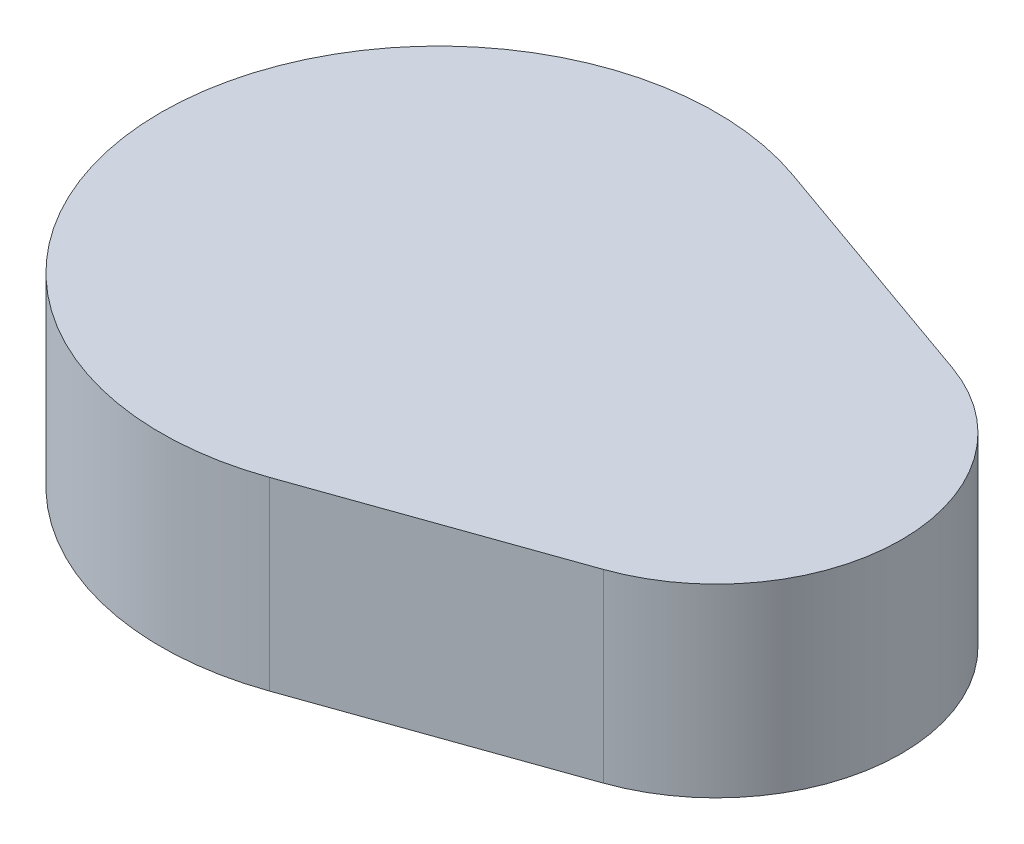
ISO-10303-21;
HEADER;
FILE_DESCRIPTION(('STEP AP214'),'2;1');
FILE_NAME('part.step','',(''),(''),'','','');
FILE_SCHEMA(('AUTOMOTIVE_DESIGN { 1 0 10303 214 1 1 1 1 }'));
ENDSEC;
DATA;
#1=APPLICATION_CONTEXT('core data for automotive mechanical design processes');
#2=APPLICATION_PROTOCOL_DEFINITION('international standard','automotive_design',2000,#1);
#3=PRODUCT_CONTEXT('',#1,'mechanical');
#4=PRODUCT('Part','Part','',(#3));
#5=PRODUCT_RELATED_PRODUCT_CATEGORY('part','',(#4));
#6=PRODUCT_DEFINITION_FORMATION('','',#4);
#7=PRODUCT_DEFINITION_CONTEXT('part definition',#1,'design');
#8=PRODUCT_DEFINITION('design','',#6,#7);
#9=PRODUCT_DEFINITION_SHAPE('','',#8);
#10=(LENGTH_UNIT() NAMED_UNIT(*) SI_UNIT(.MILLI.,.METRE.));
#11=(NAMED_UNIT(*) PLANE_ANGLE_UNIT() SI_UNIT($,.RADIAN.));
#12=(NAMED_UNIT(*) SI_UNIT($,.STERADIAN.) SOLID_ANGLE_UNIT());
#13=UNCERTAINTY_MEASURE_WITH_UNIT(LENGTH_MEASURE(1.E-05),#10,'distance_accuracy_value','');
#14=(GEOMETRIC_REPRESENTATION_CONTEXT(3) GLOBAL_UNCERTAINTY_ASSIGNED_CONTEXT((#13)) GLOBAL_UNIT_ASSIGNED_CONTEXT((#10,
#11,#12)) REPRESENTATION_CONTEXT('',''));
#15=CARTESIAN_POINT('',(0.,0.,0.));
#16=DIRECTION('',(0.,0.,1.));
#17=DIRECTION('',(1.,0.,0.));
#18=AXIS2_PLACEMENT_3D('',#15,#16,#17);
#19=CARTESIAN_POINT('',(0.,10.,0.));
#20=DIRECTION('',(0.,-1.,0.));
#21=DIRECTION('',(0.,0.,-1.));
#22=AXIS2_PLACEMENT_3D('',#19,#20,#21);
#23=CYLINDRICAL_SURFACE('',#22,15.);
#24=CARTESIAN_POINT('',(0.,0.,0.));
#25=DIRECTION('',(0.,1.,0.));
#26=DIRECTION('',(0.,0.,-1.));
#27=AXIS2_PLACEMENT_3D('',#24,#25,#26);
#28=CIRCLE('',#27,15.);
#29=CARTESIAN_POINT('',(5.,0.,-14.142135623731));
#30=VERTEX_POINT('',#29);
#31=CARTESIAN_POINT('',(5.,0.,14.142135623731));
#32=VERTEX_POINT('',#31);
#33=EDGE_CURVE('E102',#30,#32,#28,.T.);
#34=ORIENTED_EDGE('',*,*,#33,.T.);
#35=DIRECTION('',(0.,-1.,0.));
#36=VECTOR('',#35,1.);
#37=CARTESIAN_POINT('',(5.,10.,14.142135623731));
#38=LINE('',#37,#36);
#39=CARTESIAN_POINT('',(5.,10.,14.142135623731));
#40=VERTEX_POINT('',#39);
#41=EDGE_CURVE('E11',#40,#32,#38,.T.);
#42=ORIENTED_EDGE('',*,*,#41,.F.);
#43=CARTESIAN_POINT('',(0.,10.,0.));
#44=DIRECTION('',(0.,1.,0.));
#45=DIRECTION('',(0.,0.,-1.));
#46=AXIS2_PLACEMENT_3D('',#43,#44,#45);
#47=CIRCLE('',#46,15.);
#48=CARTESIAN_POINT('',(5.,10.,-14.142135623731));
#49=VERTEX_POINT('',#48);
#50=EDGE_CURVE('E90',#49,#40,#47,.T.);
#51=ORIENTED_EDGE('',*,*,#50,.F.);
#52=DIRECTION('',(0.,-1.,0.));
#53=VECTOR('',#52,1.);
#54=CARTESIAN_POINT('',(5.,10.,-14.142135623731));
#55=LINE('',#54,#53);
#56=EDGE_CURVE('E98',#49,#30,#55,.T.);
#57=ORIENTED_EDGE('',*,*,#56,.T.);
#58=EDGE_LOOP('',(#34,#42,#51,#57));
#59=FACE_BOUND('',#58,.T.);
#60=ADVANCED_FACE('F39',(#59),#23,.T.);
#61=CARTESIAN_POINT('',(5.,10.,14.142135623731));
#62=DIRECTION('',(-0.333333333333333,0.,-0.942809041582063));
#63=DIRECTION('',(-0.942809041582063,0.,0.333333333333333));
#64=AXIS2_PLACEMENT_3D('',#61,#62,#63);
#65=PLANE('',#64);
#66=DIRECTION('',(0.942809041582063,0.,-0.333333333333333));
#67=VECTOR('',#66,1.);
#68=CARTESIAN_POINT('',(5.,0.,14.142135623731));
#69=LINE('',#68,#67);
#70=CARTESIAN_POINT('',(18.3333333333333,0.,9.42809041582064));
#71=VERTEX_POINT('',#70);
#72=EDGE_CURVE('E94',#32,#71,#69,.T.);
#73=ORIENTED_EDGE('',*,*,#72,.T.);
#74=DIRECTION('',(0.,-1.,0.));
#75=VECTOR('',#74,1.);
#76=CARTESIAN_POINT('',(18.3333333333333,10.,9.42809041582064));
#77=LINE('',#76,#75);
#78=CARTESIAN_POINT('',(18.3333333333333,10.,9.42809041582064));
#79=VERTEX_POINT('',#78);
#80=EDGE_CURVE('E47',#79,#71,#77,.T.);
#81=ORIENTED_EDGE('',*,*,#80,.F.);
#82=DIRECTION('',(0.942809041582063,0.,-0.333333333333333));
#83=VECTOR('',#82,1.);
#84=CARTESIAN_POINT('',(5.,10.,14.142135623731));
#85=LINE('',#84,#83);
#86=EDGE_CURVE('E85',#40,#79,#85,.T.);
#87=ORIENTED_EDGE('',*,*,#86,.F.);
#88=ORIENTED_EDGE('',*,*,#41,.T.);
#89=EDGE_LOOP('',(#73,#81,#87,#88));
#90=FACE_BOUND('',#89,.T.);
#91=ADVANCED_FACE('F93',(#90),#65,.F.);
#92=CARTESIAN_POINT('',(15.,10.,0.));
#93=DIRECTION('',(0.,-1.,0.));
#94=DIRECTION('',(0.,0.,-1.));
#95=AXIS2_PLACEMENT_3D('',#92,#93,#94);
#96=CYLINDRICAL_SURFACE('',#95,10.);
#97=CARTESIAN_POINT('',(15.,0.,0.));
#98=DIRECTION('',(0.,1.,0.));
#99=DIRECTION('',(0.,0.,-1.));
#100=AXIS2_PLACEMENT_3D('',#97,#98,#99);
#101=CIRCLE('',#100,10.);
#102=CARTESIAN_POINT('',(18.3333333333333,0.,-9.42809041582064));
#103=VERTEX_POINT('',#102);
#104=EDGE_CURVE('E72',#71,#103,#101,.T.);
#105=ORIENTED_EDGE('',*,*,#104,.T.);
#106=DIRECTION('',(0.,-1.,0.));
#107=VECTOR('',#106,1.);
#108=CARTESIAN_POINT('',(18.3333333333333,10.,-9.42809041582064));
#109=LINE('',#108,#107);
#110=CARTESIAN_POINT('',(18.3333333333333,10.,-9.42809041582064));
#111=VERTEX_POINT('',#110);
#112=EDGE_CURVE('E95',#111,#103,#109,.T.);
#113=ORIENTED_EDGE('',*,*,#112,.F.);
#114=CARTESIAN_POINT('',(15.,10.,0.));
#115=DIRECTION('',(0.,1.,0.));
#116=DIRECTION('',(0.,0.,-1.));
#117=AXIS2_PLACEMENT_3D('',#114,#115,#116);
#118=CIRCLE('',#117,10.);
#119=EDGE_CURVE('E88',#79,#111,#118,.T.);
#120=ORIENTED_EDGE('',*,*,#119,.F.);
#121=ORIENTED_EDGE('',*,*,#80,.T.);
#122=EDGE_LOOP('',(#105,#113,#120,#121));
#123=FACE_BOUND('',#122,.T.);
#124=ADVANCED_FACE('F96',(#123),#96,.T.);
#125=CARTESIAN_POINT('',(5.,10.,-14.142135623731));
#126=DIRECTION('',(-0.333333333333333,0.,0.942809041582063));
#127=DIRECTION('',(0.942809041582063,0.,0.333333333333333));
#128=AXIS2_PLACEMENT_3D('',#125,#126,#127);
#129=PLANE('',#128);
#130=DIRECTION('',(-0.942809041582063,0.,-0.333333333333333));
#131=VECTOR('',#130,1.);
#132=CARTESIAN_POINT('',(5.,0.,-14.142135623731));
#133=LINE('',#132,#131);
#134=EDGE_CURVE('E78',#103,#30,#133,.T.);
#135=ORIENTED_EDGE('',*,*,#134,.T.);
#136=ORIENTED_EDGE('',*,*,#56,.F.);
#137=DIRECTION('',(-0.942809041582063,0.,-0.333333333333333));
#138=VECTOR('',#137,1.);
#139=CARTESIAN_POINT('',(5.,10.,-14.142135623731));
#140=LINE('',#139,#138);
#141=EDGE_CURVE('E55',#111,#49,#140,.T.);
#142=ORIENTED_EDGE('',*,*,#141,.F.);
#143=ORIENTED_EDGE('',*,*,#112,.T.);
#144=EDGE_LOOP('',(#135,#136,#142,#143));
#145=FACE_BOUND('',#144,.T.);
#146=ADVANCED_FACE('F109',(#145),#129,.F.);
#147=CARTESIAN_POINT('',(0.,10.,0.));
#148=DIRECTION('',(0.,-1.,0.));
#149=DIRECTION('',(0.,0.,-1.));
#150=AXIS2_PLACEMENT_3D('',#147,#148,#149);
#151=PLANE('',#150);
#152=ORIENTED_EDGE('',*,*,#50,.T.);
#153=ORIENTED_EDGE('',*,*,#86,.T.);
#154=ORIENTED_EDGE('',*,*,#119,.T.);
#155=ORIENTED_EDGE('',*,*,#141,.T.);
#156=EDGE_LOOP('',(#152,#153,#154,#155));
#157=FACE_BOUND('',#156,.T.);
#158=ADVANCED_FACE('F86',(#157),#151,.F.);
#159=CARTESIAN_POINT('',(0.,0.,0.));
#160=DIRECTION('',(0.,-1.,0.));
#161=DIRECTION('',(0.,0.,-1.));
#162=AXIS2_PLACEMENT_3D('',#159,#160,#161);
#163=PLANE('',#162);
#164=ORIENTED_EDGE('',*,*,#33,.F.);
#165=ORIENTED_EDGE('',*,*,#134,.F.);
#166=ORIENTED_EDGE('',*,*,#104,.F.);
#167=ORIENTED_EDGE('',*,*,#72,.F.);
#168=EDGE_LOOP('',(#164,#165,#166,#167));
#169=FACE_BOUND('',#168,.T.);
#170=ADVANCED_FACE('F112',(#169),#163,.T.);
#171=CLOSED_SHELL('',(#60,#91,#124,#146,#158,#170));
#172=MANIFOLD_SOLID_BREP('B2',#171);
#173=ADVANCED_BREP_SHAPE_REPRESENTATION('',(#18,#172),#14);
#174=SHAPE_DEFINITION_REPRESENTATION(#9,#173);
ENDSEC;
END-ISO-10303-21;
